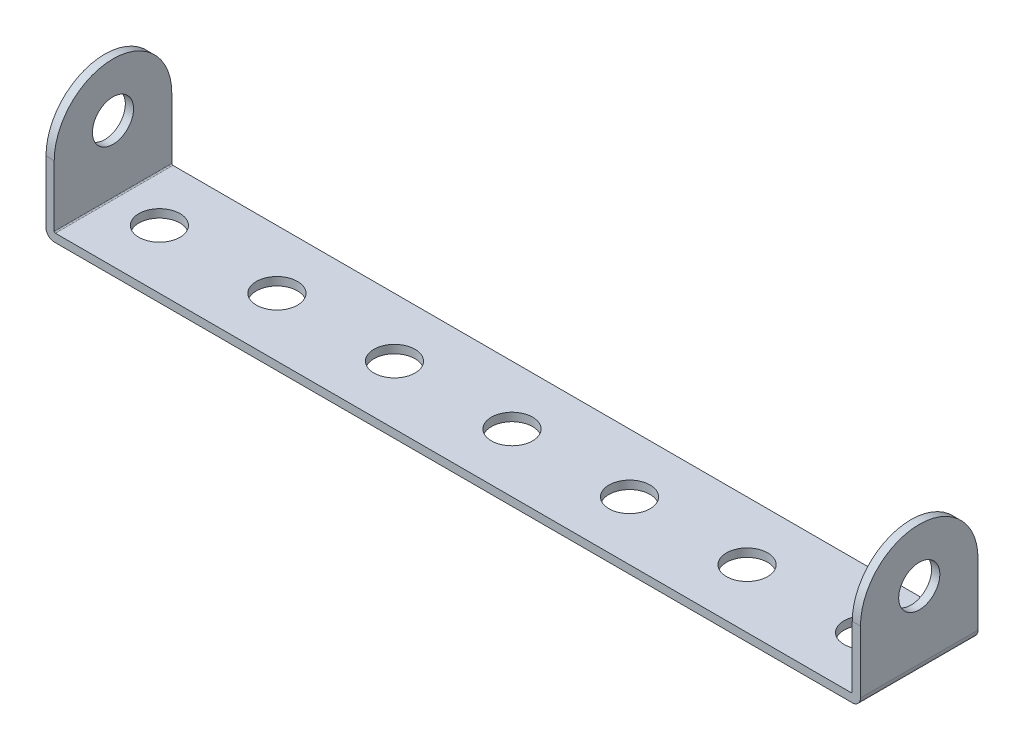
ISO-10303-21;
HEADER;
FILE_DESCRIPTION(('STEP AP214'),'2;1');
FILE_NAME('part.step','',(''),(''),'','','');
FILE_SCHEMA(('AUTOMOTIVE_DESIGN { 1 0 10303 214 1 1 1 1 }'));
ENDSEC;
DATA;
#1=APPLICATION_CONTEXT('core data for automotive mechanical design processes');
#2=APPLICATION_PROTOCOL_DEFINITION('international standard','automotive_design',2000,#1);
#3=PRODUCT_CONTEXT('',#1,'mechanical');
#4=PRODUCT('Part','Part','',(#3));
#5=PRODUCT_RELATED_PRODUCT_CATEGORY('part','',(#4));
#6=PRODUCT_DEFINITION_FORMATION('','',#4);
#7=PRODUCT_DEFINITION_CONTEXT('part definition',#1,'design');
#8=PRODUCT_DEFINITION('design','',#6,#7);
#9=PRODUCT_DEFINITION_SHAPE('','',#8);
#10=(LENGTH_UNIT() NAMED_UNIT(*) SI_UNIT(.MILLI.,.METRE.));
#11=(NAMED_UNIT(*) PLANE_ANGLE_UNIT() SI_UNIT($,.RADIAN.));
#12=(NAMED_UNIT(*) SI_UNIT($,.STERADIAN.) SOLID_ANGLE_UNIT());
#13=UNCERTAINTY_MEASURE_WITH_UNIT(LENGTH_MEASURE(1.E-05),#10,'distance_accuracy_value','');
#14=(GEOMETRIC_REPRESENTATION_CONTEXT(3) GLOBAL_UNCERTAINTY_ASSIGNED_CONTEXT((#13)) GLOBAL_UNIT_ASSIGNED_CONTEXT((#10,
#11,#12)) REPRESENTATION_CONTEXT('',''));
#15=CARTESIAN_POINT('',(0.,0.,0.));
#16=DIRECTION('',(0.,0.,1.));
#17=DIRECTION('',(1.,0.,0.));
#18=AXIS2_PLACEMENT_3D('',#15,#16,#17);
#19=CARTESIAN_POINT('',(69.4055,0.888999999999997,6.34999999999995));
#20=DIRECTION('',(0.,-1.,0.));
#21=DIRECTION('',(0.,0.,-1.));
#22=AXIS2_PLACEMENT_3D('',#19,#20,#21);
#23=CYLINDRICAL_SURFACE('',#22,2.2225);
#24=CARTESIAN_POINT('',(69.4055,0.,6.34999999999999));
#25=DIRECTION('',(0.,1.,0.));
#26=DIRECTION('',(1.,0.,0.));
#27=AXIS2_PLACEMENT_3D('',#24,#25,#26);
#28=CIRCLE('',#27,2.2225);
#29=CARTESIAN_POINT('',(71.628,0.,6.35));
#30=VERTEX_POINT('',#29);
#31=EDGE_CURVE('E231',#30,#30,#28,.T.);
#32=ORIENTED_EDGE('',*,*,#31,.F.);
#33=EDGE_LOOP('',(#32));
#34=FACE_BOUND('',#33,.T.);
#35=CARTESIAN_POINT('',(69.4055,0.888999999999997,6.34999999999995));
#36=DIRECTION('',(0.,-1.,0.));
#37=DIRECTION('',(0.,0.,-1.));
#38=AXIS2_PLACEMENT_3D('',#35,#36,#37);
#39=CIRCLE('',#38,2.2225);
#40=CARTESIAN_POINT('',(69.4055,0.888999999999997,4.12749999999995));
#41=VERTEX_POINT('',#40);
#42=EDGE_CURVE('E223',#41,#41,#39,.T.);
#43=ORIENTED_EDGE('',*,*,#42,.F.);
#44=EDGE_LOOP('',(#43));
#45=FACE_BOUND('',#44,.T.);
#46=ADVANCED_FACE('F16',(#34,#45),#23,.F.);
#47=CARTESIAN_POINT('',(5.90550000000001,0.888999999999994,6.34999999999998));
#48=DIRECTION('',(0.,-1.,0.));
#49=DIRECTION('',(0.,0.,-1.));
#50=AXIS2_PLACEMENT_3D('',#47,#48,#49);
#51=CYLINDRICAL_SURFACE('',#50,2.2225);
#52=CARTESIAN_POINT('',(5.90550000000001,0.,6.34999999999999));
#53=DIRECTION('',(0.,1.,0.));
#54=DIRECTION('',(1.,0.,0.));
#55=AXIS2_PLACEMENT_3D('',#52,#53,#54);
#56=CIRCLE('',#55,2.2225);
#57=CARTESIAN_POINT('',(8.12800000000001,0.,6.35));
#58=VERTEX_POINT('',#57);
#59=EDGE_CURVE('E397',#58,#58,#56,.T.);
#60=ORIENTED_EDGE('',*,*,#59,.F.);
#61=EDGE_LOOP('',(#60));
#62=FACE_BOUND('',#61,.T.);
#63=CARTESIAN_POINT('',(5.90550000000001,0.888999999999994,6.34999999999998));
#64=DIRECTION('',(0.,-1.,0.));
#65=DIRECTION('',(0.,0.,-1.));
#66=AXIS2_PLACEMENT_3D('',#63,#64,#65);
#67=CIRCLE('',#66,2.2225);
#68=CARTESIAN_POINT('',(5.90550000000001,0.888999999999994,4.12749999999998));
#69=VERTEX_POINT('',#68);
#70=EDGE_CURVE('E393',#69,#69,#67,.T.);
#71=ORIENTED_EDGE('',*,*,#70,.F.);
#72=EDGE_LOOP('',(#71));
#73=FACE_BOUND('',#72,.T.);
#74=ADVANCED_FACE('F319',(#62,#73),#51,.F.);
#75=CARTESIAN_POINT('',(31.3055,0.88899999999999,6.34999999999998));
#76=DIRECTION('',(0.,-1.,0.));
#77=DIRECTION('',(0.,0.,-1.));
#78=AXIS2_PLACEMENT_3D('',#75,#76,#77);
#79=CYLINDRICAL_SURFACE('',#78,2.2225);
#80=CARTESIAN_POINT('',(31.3055,0.,6.34999999999999));
#81=DIRECTION('',(0.,1.,0.));
#82=DIRECTION('',(1.,0.,0.));
#83=AXIS2_PLACEMENT_3D('',#80,#81,#82);
#84=CIRCLE('',#83,2.2225);
#85=CARTESIAN_POINT('',(33.528,0.,6.35));
#86=VERTEX_POINT('',#85);
#87=EDGE_CURVE('E389',#86,#86,#84,.T.);
#88=ORIENTED_EDGE('',*,*,#87,.F.);
#89=EDGE_LOOP('',(#88));
#90=FACE_BOUND('',#89,.T.);
#91=CARTESIAN_POINT('',(31.3055,0.88899999999999,6.34999999999998));
#92=DIRECTION('',(0.,-1.,0.));
#93=DIRECTION('',(0.,0.,-1.));
#94=AXIS2_PLACEMENT_3D('',#91,#92,#93);
#95=CIRCLE('',#94,2.2225);
#96=CARTESIAN_POINT('',(31.3055,0.88899999999999,4.12749999999998));
#97=VERTEX_POINT('',#96);
#98=EDGE_CURVE('E385',#97,#97,#95,.T.);
#99=ORIENTED_EDGE('',*,*,#98,.F.);
#100=EDGE_LOOP('',(#99));
#101=FACE_BOUND('',#100,.T.);
#102=ADVANCED_FACE('F325',(#90,#101),#79,.F.);
#103=CARTESIAN_POINT('',(44.0055,0.88899999999999,6.34999999999998));
#104=DIRECTION('',(0.,-1.,0.));
#105=DIRECTION('',(0.,0.,-1.));
#106=AXIS2_PLACEMENT_3D('',#103,#104,#105);
#107=CYLINDRICAL_SURFACE('',#106,2.2225);
#108=CARTESIAN_POINT('',(44.0055,0.,6.34999999999995));
#109=DIRECTION('',(0.,1.,0.));
#110=DIRECTION('',(1.,0.,0.));
#111=AXIS2_PLACEMENT_3D('',#108,#109,#110);
#112=CIRCLE('',#111,2.2225);
#113=CARTESIAN_POINT('',(46.228,0.,6.34999999999995));
#114=VERTEX_POINT('',#113);
#115=EDGE_CURVE('E381',#114,#114,#112,.T.);
#116=ORIENTED_EDGE('',*,*,#115,.F.);
#117=EDGE_LOOP('',(#116));
#118=FACE_BOUND('',#117,.T.);
#119=CARTESIAN_POINT('',(44.0055,0.88899999999999,6.34999999999998));
#120=DIRECTION('',(0.,-1.,0.));
#121=DIRECTION('',(0.,0.,-1.));
#122=AXIS2_PLACEMENT_3D('',#119,#120,#121);
#123=CIRCLE('',#122,2.2225);
#124=CARTESIAN_POINT('',(44.0055,0.88899999999999,4.12749999999998));
#125=VERTEX_POINT('',#124);
#126=EDGE_CURVE('E377',#125,#125,#123,.T.);
#127=ORIENTED_EDGE('',*,*,#126,.F.);
#128=EDGE_LOOP('',(#127));
#129=FACE_BOUND('',#128,.T.);
#130=ADVANCED_FACE('F335',(#118,#129),#107,.F.);
#131=CARTESIAN_POINT('',(18.6054999999999,0.888999999999997,6.34999999999998));
#132=DIRECTION('',(0.,-1.,0.));
#133=DIRECTION('',(0.,0.,-1.));
#134=AXIS2_PLACEMENT_3D('',#131,#132,#133);
#135=CYLINDRICAL_SURFACE('',#134,2.2225);
#136=CARTESIAN_POINT('',(18.6054999999999,0.,6.34999999999999));
#137=DIRECTION('',(0.,1.,0.));
#138=DIRECTION('',(1.,0.,0.));
#139=AXIS2_PLACEMENT_3D('',#136,#137,#138);
#140=CIRCLE('',#139,2.2225);
#141=CARTESIAN_POINT('',(20.8279999999999,0.,6.35));
#142=VERTEX_POINT('',#141);
#143=EDGE_CURVE('E373',#142,#142,#140,.T.);
#144=ORIENTED_EDGE('',*,*,#143,.F.);
#145=EDGE_LOOP('',(#144));
#146=FACE_BOUND('',#145,.T.);
#147=CARTESIAN_POINT('',(18.6054999999999,0.888999999999997,6.34999999999998));
#148=DIRECTION('',(0.,-1.,0.));
#149=DIRECTION('',(0.,0.,-1.));
#150=AXIS2_PLACEMENT_3D('',#147,#148,#149);
#151=CIRCLE('',#150,2.2225);
#152=CARTESIAN_POINT('',(18.6054999999999,0.888999999999997,4.12749999999998));
#153=VERTEX_POINT('',#152);
#154=EDGE_CURVE('E364',#153,#153,#151,.T.);
#155=ORIENTED_EDGE('',*,*,#154,.F.);
#156=EDGE_LOOP('',(#155));
#157=FACE_BOUND('',#156,.T.);
#158=ADVANCED_FACE('F339',(#146,#157),#135,.F.);
#159=CARTESIAN_POINT('',(56.7055,0.888999999999994,6.34999999999998));
#160=DIRECTION('',(0.,-1.,0.));
#161=DIRECTION('',(0.,0.,-1.));
#162=AXIS2_PLACEMENT_3D('',#159,#160,#161);
#163=CYLINDRICAL_SURFACE('',#162,2.2225);
#164=CARTESIAN_POINT('',(56.7055,0.,6.34999999999999));
#165=DIRECTION('',(0.,1.,0.));
#166=DIRECTION('',(1.,0.,0.));
#167=AXIS2_PLACEMENT_3D('',#164,#165,#166);
#168=CIRCLE('',#167,2.2225);
#169=CARTESIAN_POINT('',(58.928,0.,6.35));
#170=VERTEX_POINT('',#169);
#171=EDGE_CURVE('E368',#170,#170,#168,.T.);
#172=ORIENTED_EDGE('',*,*,#171,.F.);
#173=EDGE_LOOP('',(#172));
#174=FACE_BOUND('',#173,.T.);
#175=CARTESIAN_POINT('',(56.7055,0.888999999999994,6.34999999999998));
#176=DIRECTION('',(0.,-1.,0.));
#177=DIRECTION('',(0.,0.,-1.));
#178=AXIS2_PLACEMENT_3D('',#175,#176,#177);
#179=CIRCLE('',#178,2.2225);
#180=CARTESIAN_POINT('',(56.7055,0.888999999999994,4.12749999999998));
#181=VERTEX_POINT('',#180);
#182=EDGE_CURVE('E359',#181,#181,#179,.T.);
#183=ORIENTED_EDGE('',*,*,#182,.F.);
#184=EDGE_LOOP('',(#183));
#185=FACE_BOUND('',#184,.T.);
#186=ADVANCED_FACE('F341',(#174,#185),#163,.F.);
#187=CARTESIAN_POINT('',(82.1055,0.888999999999997,6.34999999999997));
#188=DIRECTION('',(0.,-1.,0.));
#189=DIRECTION('',(0.,0.,-1.));
#190=AXIS2_PLACEMENT_3D('',#187,#188,#189);
#191=CYLINDRICAL_SURFACE('',#190,2.2225);
#192=CARTESIAN_POINT('',(82.1055,0.,6.35000000000001));
#193=DIRECTION('',(0.,1.,0.));
#194=DIRECTION('',(1.,0.,0.));
#195=AXIS2_PLACEMENT_3D('',#192,#193,#194);
#196=CIRCLE('',#195,2.2225);
#197=CARTESIAN_POINT('',(84.3280000000001,0.,6.35000000000001));
#198=VERTEX_POINT('',#197);
#199=EDGE_CURVE('E211',#198,#198,#196,.T.);
#200=ORIENTED_EDGE('',*,*,#199,.F.);
#201=EDGE_LOOP('',(#200));
#202=FACE_BOUND('',#201,.T.);
#203=CARTESIAN_POINT('',(82.1055,0.888999999999997,6.34999999999997));
#204=DIRECTION('',(0.,-1.,0.));
#205=DIRECTION('',(0.,0.,-1.));
#206=AXIS2_PLACEMENT_3D('',#203,#204,#205);
#207=CIRCLE('',#206,2.2225);
#208=CARTESIAN_POINT('',(82.1055,0.888999999999997,4.12749999999997));
#209=VERTEX_POINT('',#208);
#210=EDGE_CURVE('E191',#209,#209,#207,.T.);
#211=ORIENTED_EDGE('',*,*,#210,.F.);
#212=EDGE_LOOP('',(#211));
#213=FACE_BOUND('',#212,.T.);
#214=ADVANCED_FACE('F315',(#202,#213),#191,.F.);
#215=CARTESIAN_POINT('',(88.011,7.61999999999998,6.34999999999997));
#216=DIRECTION('',(-1.,0.,0.));
#217=DIRECTION('',(0.,0.,1.));
#218=AXIS2_PLACEMENT_3D('',#215,#216,#217);
#219=CYLINDRICAL_SURFACE('',#218,6.35);
#220=CARTESIAN_POINT('',(0.889000000000029,7.62000000000004,6.34999999999994));
#221=DIRECTION('',(1.,0.,0.));
#222=DIRECTION('',(0.,1.,0.));
#223=AXIS2_PLACEMENT_3D('',#220,#221,#222);
#224=CIRCLE('',#223,6.35);
#225=CARTESIAN_POINT('',(0.889000000000029,7.61999999999996,0.));
#226=VERTEX_POINT('',#225);
#227=CARTESIAN_POINT('',(0.889000000000029,7.61999999999998,12.7));
#228=VERTEX_POINT('',#227);
#229=EDGE_CURVE('E173',#226,#228,#224,.T.);
#230=ORIENTED_EDGE('',*,*,#229,.F.);
#231=DIRECTION('',(1.,0.,0.));
#232=VECTOR('',#231,1.);
#233=CARTESIAN_POINT('',(88.011,7.61999999999996,0.));
#234=LINE('',#233,#232);
#235=CARTESIAN_POINT('',(0.,7.61999999999996,0.));
#236=VERTEX_POINT('',#235);
#237=EDGE_CURVE('E36',#236,#226,#234,.T.);
#238=ORIENTED_EDGE('',*,*,#237,.F.);
#239=CARTESIAN_POINT('',(0.,7.62000000000004,6.34999999999994));
#240=DIRECTION('',(-1.,0.,0.));
#241=DIRECTION('',(0.,0.,1.));
#242=AXIS2_PLACEMENT_3D('',#239,#240,#241);
#243=CIRCLE('',#242,6.35);
#244=CARTESIAN_POINT('',(0.,7.61999999999998,12.7));
#245=VERTEX_POINT('',#244);
#246=EDGE_CURVE('E129',#245,#236,#243,.T.);
#247=ORIENTED_EDGE('',*,*,#246,.F.);
#248=DIRECTION('',(1.,0.,0.));
#249=VECTOR('',#248,1.);
#250=CARTESIAN_POINT('',(88.011,7.61999999999996,12.7));
#251=LINE('',#250,#249);
#252=EDGE_CURVE('E11',#245,#228,#251,.T.);
#253=ORIENTED_EDGE('',*,*,#252,.T.);
#254=EDGE_LOOP('',(#230,#238,#247,#253));
#255=FACE_BOUND('',#254,.T.);
#256=ADVANCED_FACE('F279',(#255),#219,.T.);
#257=CARTESIAN_POINT('',(88.011,7.61999999999998,6.34999999999997));
#258=DIRECTION('',(-1.,0.,0.));
#259=DIRECTION('',(0.,0.,1.));
#260=AXIS2_PLACEMENT_3D('',#257,#258,#259);
#261=CYLINDRICAL_SURFACE('',#260,6.35);
#262=CARTESIAN_POINT('',(87.122,7.61999999999998,6.34999999999997));
#263=DIRECTION('',(-1.,0.,0.));
#264=DIRECTION('',(0.,0.,1.));
#265=AXIS2_PLACEMENT_3D('',#262,#263,#264);
#266=CIRCLE('',#265,6.35);
#267=CARTESIAN_POINT('',(87.122,7.61999999999996,12.7));
#268=VERTEX_POINT('',#267);
#269=CARTESIAN_POINT('',(87.122,7.61999999999996,0.));
#270=VERTEX_POINT('',#269);
#271=EDGE_CURVE('E141',#268,#270,#266,.T.);
#272=ORIENTED_EDGE('',*,*,#271,.F.);
#273=DIRECTION('',(1.,0.,0.));
#274=VECTOR('',#273,1.);
#275=CARTESIAN_POINT('',(88.011,7.61999999999996,12.7));
#276=LINE('',#275,#274);
#277=CARTESIAN_POINT('',(88.011,7.61999999999996,12.7));
#278=VERTEX_POINT('',#277);
#279=EDGE_CURVE('E27',#268,#278,#276,.T.);
#280=ORIENTED_EDGE('',*,*,#279,.T.);
#281=CARTESIAN_POINT('',(88.011,7.61999999999998,6.34999999999997));
#282=DIRECTION('',(1.,0.,0.));
#283=DIRECTION('',(0.,1.,0.));
#284=AXIS2_PLACEMENT_3D('',#281,#282,#283);
#285=CIRCLE('',#284,6.35);
#286=CARTESIAN_POINT('',(88.011,7.61999999999996,0.));
#287=VERTEX_POINT('',#286);
#288=EDGE_CURVE('E151',#287,#278,#285,.T.);
#289=ORIENTED_EDGE('',*,*,#288,.F.);
#290=DIRECTION('',(1.,0.,0.));
#291=VECTOR('',#290,1.);
#292=CARTESIAN_POINT('',(88.011,7.61999999999996,0.));
#293=LINE('',#292,#291);
#294=EDGE_CURVE('E156',#270,#287,#293,.T.);
#295=ORIENTED_EDGE('',*,*,#294,.F.);
#296=EDGE_LOOP('',(#272,#280,#289,#295));
#297=FACE_BOUND('',#296,.T.);
#298=ADVANCED_FACE('F304',(#297),#261,.T.);
#299=CARTESIAN_POINT('',(88.011,8.19149999999996,6.35000000000001));
#300=DIRECTION('',(-1.,0.,0.));
#301=DIRECTION('',(0.,0.,1.));
#302=AXIS2_PLACEMENT_3D('',#299,#300,#301);
#303=CYLINDRICAL_SURFACE('',#302,2.2225);
#304=CARTESIAN_POINT('',(88.011,8.19149999999996,6.35000000000001));
#305=DIRECTION('',(-1.,0.,0.));
#306=DIRECTION('',(0.,0.,1.));
#307=AXIS2_PLACEMENT_3D('',#304,#305,#306);
#308=CIRCLE('',#307,2.2225);
#309=CARTESIAN_POINT('',(88.011,8.19149999999996,8.57250000000001));
#310=VERTEX_POINT('',#309);
#311=EDGE_CURVE('E154',#310,#310,#308,.T.);
#312=ORIENTED_EDGE('',*,*,#311,.F.);
#313=EDGE_LOOP('',(#312));
#314=FACE_BOUND('',#313,.T.);
#315=CARTESIAN_POINT('',(87.122,8.19149999999996,6.35000000000001));
#316=DIRECTION('',(1.,0.,0.));
#317=DIRECTION('',(0.,0.,1.));
#318=AXIS2_PLACEMENT_3D('',#315,#316,#317);
#319=CIRCLE('',#318,2.2225);
#320=CARTESIAN_POINT('',(87.122,8.19149999999996,8.57250000000001));
#321=VERTEX_POINT('',#320);
#322=EDGE_CURVE('E164',#321,#321,#319,.T.);
#323=ORIENTED_EDGE('',*,*,#322,.F.);
#324=EDGE_LOOP('',(#323));
#325=FACE_BOUND('',#324,.T.);
#326=ADVANCED_FACE('F306',(#314,#325),#303,.F.);
#327=CARTESIAN_POINT('',(88.011,8.19149999999996,6.35000000000001));
#328=DIRECTION('',(-1.,0.,0.));
#329=DIRECTION('',(0.,0.,1.));
#330=AXIS2_PLACEMENT_3D('',#327,#328,#329);
#331=CYLINDRICAL_SURFACE('',#330,2.2225);
#332=CARTESIAN_POINT('',(0.889000000000029,8.19150000000004,6.34999999999997));
#333=DIRECTION('',(-1.,0.,0.));
#334=DIRECTION('',(0.,1.,0.));
#335=AXIS2_PLACEMENT_3D('',#332,#333,#334);
#336=CIRCLE('',#335,2.2225);
#337=CARTESIAN_POINT('',(0.889000000000028,10.414,6.34999999999997));
#338=VERTEX_POINT('',#337);
#339=EDGE_CURVE('E150',#338,#338,#336,.T.);
#340=ORIENTED_EDGE('',*,*,#339,.F.);
#341=EDGE_LOOP('',(#340));
#342=FACE_BOUND('',#341,.T.);
#343=CARTESIAN_POINT('',(0.,8.19150000000004,6.34999999999997));
#344=DIRECTION('',(1.,0.,0.));
#345=DIRECTION('',(0.,1.,0.));
#346=AXIS2_PLACEMENT_3D('',#343,#344,#345);
#347=CIRCLE('',#346,2.2225);
#348=CARTESIAN_POINT('',(0.,10.414,6.34999999999997));
#349=VERTEX_POINT('',#348);
#350=EDGE_CURVE('E159',#349,#349,#347,.T.);
#351=ORIENTED_EDGE('',*,*,#350,.F.);
#352=EDGE_LOOP('',(#351));
#353=FACE_BOUND('',#352,.T.);
#354=ADVANCED_FACE('F312',(#342,#353),#331,.F.);
#355=CARTESIAN_POINT('',(44.0054999999999,2.14211144567669,12.7));
#356=DIRECTION('',(0.,0.,1.));
#357=DIRECTION('',(1.,0.,0.));
#358=AXIS2_PLACEMENT_3D('',#355,#356,#357);
#359=PLANE('',#358);
#360=ORIENTED_EDGE('',*,*,#279,.F.);
#361=DIRECTION('',(0.,1.,0.));
#362=VECTOR('',#361,1.);
#363=CARTESIAN_POINT('',(87.122,13.97,12.7));
#364=LINE('',#363,#362);
#365=CARTESIAN_POINT('',(87.122,1.01599999999999,12.7));
#366=VERTEX_POINT('',#365);
#367=EDGE_CURVE('E168',#366,#268,#364,.T.);
#368=ORIENTED_EDGE('',*,*,#367,.F.);
#369=CARTESIAN_POINT('',(86.9949999999999,1.01600000000004,12.7));
#370=DIRECTION('',(0.,0.,1.));
#371=DIRECTION('',(1.,0.,0.));
#372=AXIS2_PLACEMENT_3D('',#369,#370,#371);
#373=CIRCLE('',#372,0.127);
#374=CARTESIAN_POINT('',(86.995,0.888999999999997,12.7));
#375=VERTEX_POINT('',#374);
#376=EDGE_CURVE('E181',#375,#366,#373,.T.);
#377=ORIENTED_EDGE('',*,*,#376,.F.);
#378=DIRECTION('',(1.,0.,0.));
#379=VECTOR('',#378,1.);
#380=CARTESIAN_POINT('',(86.995,0.888999999999997,12.7));
#381=LINE('',#380,#379);
#382=CARTESIAN_POINT('',(1.01599999999991,0.888999999999942,12.7));
#383=VERTEX_POINT('',#382);
#384=EDGE_CURVE('E187',#383,#375,#381,.T.);
#385=ORIENTED_EDGE('',*,*,#384,.F.);
#386=CARTESIAN_POINT('',(1.01599999999991,1.01599999999999,12.7));
#387=DIRECTION('',(0.,0.,1.));
#388=DIRECTION('',(1.,0.,0.));
#389=AXIS2_PLACEMENT_3D('',#386,#387,#388);
#390=CIRCLE('',#389,0.127);
#391=CARTESIAN_POINT('',(0.888999999999918,1.01599999999999,12.7));
#392=VERTEX_POINT('',#391);
#393=EDGE_CURVE('E193',#392,#383,#390,.T.);
#394=ORIENTED_EDGE('',*,*,#393,.F.);
#395=DIRECTION('',(0.,-1.,0.));
#396=VECTOR('',#395,1.);
#397=CARTESIAN_POINT('',(0.888999999999918,1.01599999999999,12.7));
#398=LINE('',#397,#396);
#399=EDGE_CURVE('E199',#228,#392,#398,.T.);
#400=ORIENTED_EDGE('',*,*,#399,.F.);
#401=ORIENTED_EDGE('',*,*,#252,.F.);
#402=DIRECTION('',(0.,1.,0.));
#403=VECTOR('',#402,1.);
#404=CARTESIAN_POINT('',(0.,13.97,12.7));
#405=LINE('',#404,#403);
#406=CARTESIAN_POINT('',(0.,0.888999999999942,12.7));
#407=VERTEX_POINT('',#406);
#408=EDGE_CURVE('E120',#407,#245,#405,.T.);
#409=ORIENTED_EDGE('',*,*,#408,.F.);
#410=CARTESIAN_POINT('',(0.889000000000029,0.889000000000053,12.7));
#411=DIRECTION('',(0.,0.,-1.));
#412=DIRECTION('',(0.,-1.,0.));
#413=AXIS2_PLACEMENT_3D('',#410,#411,#412);
#414=CIRCLE('',#413,0.889);
#415=CARTESIAN_POINT('',(0.889000000000029,0.,12.7));
#416=VERTEX_POINT('',#415);
#417=EDGE_CURVE('E115',#416,#407,#414,.T.);
#418=ORIENTED_EDGE('',*,*,#417,.F.);
#419=DIRECTION('',(-1.,0.,0.));
#420=VECTOR('',#419,1.);
#421=CARTESIAN_POINT('',(0.889000000000029,0.,12.7));
#422=LINE('',#421,#420);
#423=CARTESIAN_POINT('',(87.122,0.,12.7));
#424=VERTEX_POINT('',#423);
#425=EDGE_CURVE('E208',#424,#416,#422,.T.);
#426=ORIENTED_EDGE('',*,*,#425,.F.);
#427=CARTESIAN_POINT('',(87.122,0.889000000000001,12.7));
#428=DIRECTION('',(0.,0.,-1.));
#429=DIRECTION('',(0.,-1.,0.));
#430=AXIS2_PLACEMENT_3D('',#427,#428,#429);
#431=CIRCLE('',#430,0.889000000000006);
#432=CARTESIAN_POINT('',(88.011,0.888999999999997,12.7));
#433=VERTEX_POINT('',#432);
#434=EDGE_CURVE('E169',#433,#424,#431,.T.);
#435=ORIENTED_EDGE('',*,*,#434,.F.);
#436=DIRECTION('',(0.,-1.,0.));
#437=VECTOR('',#436,1.);
#438=CARTESIAN_POINT('',(88.011,0.888999999999997,12.7));
#439=LINE('',#438,#437);
#440=EDGE_CURVE('E155',#278,#433,#439,.T.);
#441=ORIENTED_EDGE('',*,*,#440,.F.);
#442=EDGE_LOOP('',(#360,#368,#377,#385,#394,#400,#401,#409,#418,#426,#435,#441));
#443=FACE_BOUND('',#442,.T.);
#444=ADVANCED_FACE('F275',(#443),#359,.T.);
#445=CARTESIAN_POINT('',(0.889000000000029,13.97,0.));
#446=DIRECTION('',(1.,0.,0.));
#447=DIRECTION('',(0.,1.,0.));
#448=AXIS2_PLACEMENT_3D('',#445,#446,#447);
#449=PLANE('',#448);
#450=ORIENTED_EDGE('',*,*,#339,.T.);
#451=EDGE_LOOP('',(#450));
#452=FACE_BOUND('',#451,.T.);
#453=ORIENTED_EDGE('',*,*,#229,.T.);
#454=ORIENTED_EDGE('',*,*,#399,.T.);
#455=DIRECTION('',(0.,0.,1.));
#456=VECTOR('',#455,1.);
#457=CARTESIAN_POINT('',(0.889000000000029,1.01600000000005,0.));
#458=LINE('',#457,#456);
#459=CARTESIAN_POINT('',(0.889000000000029,1.01600000000005,0.));
#460=VERTEX_POINT('',#459);
#461=EDGE_CURVE('E219',#460,#392,#458,.T.);
#462=ORIENTED_EDGE('',*,*,#461,.F.);
#463=DIRECTION('',(0.,1.,0.));
#464=VECTOR('',#463,1.);
#465=CARTESIAN_POINT('',(0.889000000000029,1.01600000000005,0.));
#466=LINE('',#465,#464);
#467=EDGE_CURVE('E163',#460,#226,#466,.T.);
#468=ORIENTED_EDGE('',*,*,#467,.T.);
#469=EDGE_LOOP('',(#453,#454,#462,#468));
#470=FACE_BOUND('',#469,.T.);
#471=ADVANCED_FACE('F290',(#452,#470),#449,.T.);
#472=CARTESIAN_POINT('',(88.011,13.97,0.));
#473=DIRECTION('',(1.,0.,0.));
#474=DIRECTION('',(0.,0.,-1.));
#475=AXIS2_PLACEMENT_3D('',#472,#473,#474);
#476=PLANE('',#475);
#477=ORIENTED_EDGE('',*,*,#311,.T.);
#478=EDGE_LOOP('',(#477));
#479=FACE_BOUND('',#478,.T.);
#480=ORIENTED_EDGE('',*,*,#288,.T.);
#481=ORIENTED_EDGE('',*,*,#440,.T.);
#482=DIRECTION('',(0.,0.,1.));
#483=VECTOR('',#482,1.);
#484=CARTESIAN_POINT('',(88.011,0.888999999999973,0.));
#485=LINE('',#484,#483);
#486=CARTESIAN_POINT('',(88.011,0.888999999999973,0.));
#487=VERTEX_POINT('',#486);
#488=EDGE_CURVE('E227',#487,#433,#485,.T.);
#489=ORIENTED_EDGE('',*,*,#488,.F.);
#490=DIRECTION('',(0.,1.,0.));
#491=VECTOR('',#490,1.);
#492=CARTESIAN_POINT('',(88.011,0.888999999999973,0.));
#493=LINE('',#492,#491);
#494=EDGE_CURVE('E197',#487,#287,#493,.T.);
#495=ORIENTED_EDGE('',*,*,#494,.T.);
#496=EDGE_LOOP('',(#480,#481,#489,#495));
#497=FACE_BOUND('',#496,.T.);
#498=ADVANCED_FACE('F271',(#479,#497),#476,.T.);
#499=CARTESIAN_POINT('',(1.01600000000002,1.01599999999999,0.));
#500=DIRECTION('',(0.,0.,1.));
#501=DIRECTION('',(1.,0.,0.));
#502=AXIS2_PLACEMENT_3D('',#499,#500,#501);
#503=CYLINDRICAL_SURFACE('',#502,0.127);
#504=ORIENTED_EDGE('',*,*,#393,.T.);
#505=DIRECTION('',(0.,0.,1.));
#506=VECTOR('',#505,1.);
#507=CARTESIAN_POINT('',(1.01600000000002,0.888999999999973,0.));
#508=LINE('',#507,#506);
#509=CARTESIAN_POINT('',(1.01600000000002,0.888999999999973,0.));
#510=VERTEX_POINT('',#509);
#511=EDGE_CURVE('E185',#510,#383,#508,.T.);
#512=ORIENTED_EDGE('',*,*,#511,.F.);
#513=CARTESIAN_POINT('',(1.01600000000002,1.01599999999999,0.));
#514=DIRECTION('',(0.,0.,-1.));
#515=DIRECTION('',(0.,-1.,0.));
#516=AXIS2_PLACEMENT_3D('',#513,#514,#515);
#517=CIRCLE('',#516,0.127);
#518=EDGE_CURVE('E198',#510,#460,#517,.T.);
#519=ORIENTED_EDGE('',*,*,#518,.T.);
#520=ORIENTED_EDGE('',*,*,#461,.T.);
#521=EDGE_LOOP('',(#504,#512,#519,#520));
#522=FACE_BOUND('',#521,.T.);
#523=ADVANCED_FACE('F294',(#522),#503,.F.);
#524=CARTESIAN_POINT('',(1.01600000000002,0.888999999999973,0.));
#525=DIRECTION('',(0.,1.,0.));
#526=DIRECTION('',(-1.,0.,0.));
#527=AXIS2_PLACEMENT_3D('',#524,#525,#526);
#528=PLANE('',#527);
#529=ORIENTED_EDGE('',*,*,#42,.T.);
#530=EDGE_LOOP('',(#529));
#531=FACE_BOUND('',#530,.T.);
#532=ORIENTED_EDGE('',*,*,#70,.T.);
#533=EDGE_LOOP('',(#532));
#534=FACE_BOUND('',#533,.T.);
#535=ORIENTED_EDGE('',*,*,#98,.T.);
#536=EDGE_LOOP('',(#535));
#537=FACE_BOUND('',#536,.T.);
#538=ORIENTED_EDGE('',*,*,#126,.T.);
#539=EDGE_LOOP('',(#538));
#540=FACE_BOUND('',#539,.T.);
#541=ORIENTED_EDGE('',*,*,#154,.T.);
#542=EDGE_LOOP('',(#541));
#543=FACE_BOUND('',#542,.T.);
#544=ORIENTED_EDGE('',*,*,#182,.T.);
#545=EDGE_LOOP('',(#544));
#546=FACE_BOUND('',#545,.T.);
#547=ORIENTED_EDGE('',*,*,#210,.T.);
#548=EDGE_LOOP('',(#547));
#549=FACE_BOUND('',#548,.T.);
#550=ORIENTED_EDGE('',*,*,#384,.T.);
#551=DIRECTION('',(0.,0.,1.));
#552=VECTOR('',#551,1.);
#553=CARTESIAN_POINT('',(86.995,0.888999999999973,0.));
#554=LINE('',#553,#552);
#555=CARTESIAN_POINT('',(86.995,0.888999999999973,0.));
#556=VERTEX_POINT('',#555);
#557=EDGE_CURVE('E145',#556,#375,#554,.T.);
#558=ORIENTED_EDGE('',*,*,#557,.F.);
#559=DIRECTION('',(-1.,0.,0.));
#560=VECTOR('',#559,1.);
#561=CARTESIAN_POINT('',(86.995,0.888999999999973,0.));
#562=LINE('',#561,#560);
#563=EDGE_CURVE('E192',#556,#510,#562,.T.);
#564=ORIENTED_EDGE('',*,*,#563,.T.);
#565=ORIENTED_EDGE('',*,*,#511,.T.);
#566=EDGE_LOOP('',(#550,#558,#564,#565));
#567=FACE_BOUND('',#566,.T.);
#568=ADVANCED_FACE('F296',(#531,#534,#537,#540,#543,#546,#549,#567),#528,.T.);
#569=CARTESIAN_POINT('',(86.9949999999999,1.01600000000002,0.));
#570=DIRECTION('',(0.,0.,1.));
#571=DIRECTION('',(1.,0.,0.));
#572=AXIS2_PLACEMENT_3D('',#569,#570,#571);
#573=CYLINDRICAL_SURFACE('',#572,0.127);
#574=ORIENTED_EDGE('',*,*,#376,.T.);
#575=DIRECTION('',(0.,0.,1.));
#576=VECTOR('',#575,1.);
#577=CARTESIAN_POINT('',(87.122,1.016,0.));
#578=LINE('',#577,#576);
#579=CARTESIAN_POINT('',(87.122,1.016,0.));
#580=VERTEX_POINT('',#579);
#581=EDGE_CURVE('E180',#580,#366,#578,.T.);
#582=ORIENTED_EDGE('',*,*,#581,.F.);
#583=CARTESIAN_POINT('',(86.9949999999999,1.01600000000002,0.));
#584=DIRECTION('',(0.,0.,-1.));
#585=DIRECTION('',(0.,-1.,0.));
#586=AXIS2_PLACEMENT_3D('',#583,#584,#585);
#587=CIRCLE('',#586,0.127);
#588=EDGE_CURVE('E186',#580,#556,#587,.T.);
#589=ORIENTED_EDGE('',*,*,#588,.T.);
#590=ORIENTED_EDGE('',*,*,#557,.T.);
#591=EDGE_LOOP('',(#574,#582,#589,#590));
#592=FACE_BOUND('',#591,.T.);
#593=ADVANCED_FACE('F299',(#592),#573,.F.);
#594=CARTESIAN_POINT('',(87.122,1.016,0.));
#595=DIRECTION('',(-1.,0.,0.));
#596=DIRECTION('',(0.,-1.,0.));
#597=AXIS2_PLACEMENT_3D('',#594,#595,#596);
#598=PLANE('',#597);
#599=ORIENTED_EDGE('',*,*,#271,.T.);
#600=DIRECTION('',(0.,-1.,0.));
#601=VECTOR('',#600,1.);
#602=CARTESIAN_POINT('',(87.122,13.97,0.));
#603=LINE('',#602,#601);
#604=EDGE_CURVE('E146',#270,#580,#603,.T.);
#605=ORIENTED_EDGE('',*,*,#604,.T.);
#606=ORIENTED_EDGE('',*,*,#581,.T.);
#607=ORIENTED_EDGE('',*,*,#367,.T.);
#608=EDGE_LOOP('',(#599,#605,#606,#607));
#609=FACE_BOUND('',#608,.T.);
#610=ORIENTED_EDGE('',*,*,#322,.T.);
#611=EDGE_LOOP('',(#610));
#612=FACE_BOUND('',#611,.T.);
#613=ADVANCED_FACE('F301',(#609,#612),#598,.T.);
#614=CARTESIAN_POINT('',(87.122,0.889000000000001,0.));
#615=DIRECTION('',(0.,0.,1.));
#616=DIRECTION('',(1.,0.,0.));
#617=AXIS2_PLACEMENT_3D('',#614,#615,#616);
#618=CYLINDRICAL_SURFACE('',#617,0.889000000000006);
#619=ORIENTED_EDGE('',*,*,#434,.T.);
#620=DIRECTION('',(0.,0.,1.));
#621=VECTOR('',#620,1.);
#622=CARTESIAN_POINT('',(87.122,0.,0.));
#623=LINE('',#622,#621);
#624=CARTESIAN_POINT('',(87.122,0.,0.));
#625=VERTEX_POINT('',#624);
#626=EDGE_CURVE('E207',#625,#424,#623,.T.);
#627=ORIENTED_EDGE('',*,*,#626,.F.);
#628=CARTESIAN_POINT('',(87.122,0.889000000000001,0.));
#629=DIRECTION('',(0.,0.,1.));
#630=DIRECTION('',(1.,0.,0.));
#631=AXIS2_PLACEMENT_3D('',#628,#629,#630);
#632=CIRCLE('',#631,0.889000000000006);
#633=EDGE_CURVE('E215',#625,#487,#632,.T.);
#634=ORIENTED_EDGE('',*,*,#633,.T.);
#635=ORIENTED_EDGE('',*,*,#488,.T.);
#636=EDGE_LOOP('',(#619,#627,#634,#635));
#637=FACE_BOUND('',#636,.T.);
#638=ADVANCED_FACE('F266',(#637),#618,.T.);
#639=CARTESIAN_POINT('',(87.122,0.,0.));
#640=DIRECTION('',(0.,-1.,0.));
#641=DIRECTION('',(1.,0.,0.));
#642=AXIS2_PLACEMENT_3D('',#639,#640,#641);
#643=PLANE('',#642);
#644=ORIENTED_EDGE('',*,*,#31,.T.);
#645=EDGE_LOOP('',(#644));
#646=FACE_BOUND('',#645,.T.);
#647=ORIENTED_EDGE('',*,*,#59,.T.);
#648=EDGE_LOOP('',(#647));
#649=FACE_BOUND('',#648,.T.);
#650=ORIENTED_EDGE('',*,*,#87,.T.);
#651=EDGE_LOOP('',(#650));
#652=FACE_BOUND('',#651,.T.);
#653=ORIENTED_EDGE('',*,*,#115,.T.);
#654=EDGE_LOOP('',(#653));
#655=FACE_BOUND('',#654,.T.);
#656=ORIENTED_EDGE('',*,*,#143,.T.);
#657=EDGE_LOOP('',(#656));
#658=FACE_BOUND('',#657,.T.);
#659=ORIENTED_EDGE('',*,*,#171,.T.);
#660=EDGE_LOOP('',(#659));
#661=FACE_BOUND('',#660,.T.);
#662=ORIENTED_EDGE('',*,*,#199,.T.);
#663=EDGE_LOOP('',(#662));
#664=FACE_BOUND('',#663,.T.);
#665=ORIENTED_EDGE('',*,*,#425,.T.);
#666=DIRECTION('',(0.,0.,1.));
#667=VECTOR('',#666,1.);
#668=CARTESIAN_POINT('',(0.889000000000029,0.,0.));
#669=LINE('',#668,#667);
#670=CARTESIAN_POINT('',(0.889000000000029,0.,0.));
#671=VERTEX_POINT('',#670);
#672=EDGE_CURVE('E105',#671,#416,#669,.T.);
#673=ORIENTED_EDGE('',*,*,#672,.F.);
#674=DIRECTION('',(1.,0.,0.));
#675=VECTOR('',#674,1.);
#676=CARTESIAN_POINT('',(0.889000000000029,0.,0.));
#677=LINE('',#676,#675);
#678=EDGE_CURVE('E124',#671,#625,#677,.T.);
#679=ORIENTED_EDGE('',*,*,#678,.T.);
#680=ORIENTED_EDGE('',*,*,#626,.T.);
#681=EDGE_LOOP('',(#665,#673,#679,#680));
#682=FACE_BOUND('',#681,.T.);
#683=ADVANCED_FACE('F264',(#646,#649,#652,#655,#658,#661,#664,#682),#643,.T.);
#684=CARTESIAN_POINT('',(0.889000000000029,0.889000000000022,0.));
#685=DIRECTION('',(0.,0.,1.));
#686=DIRECTION('',(1.,0.,0.));
#687=AXIS2_PLACEMENT_3D('',#684,#685,#686);
#688=CYLINDRICAL_SURFACE('',#687,0.889);
#689=ORIENTED_EDGE('',*,*,#417,.T.);
#690=DIRECTION('',(0.,0.,1.));
#691=VECTOR('',#690,1.);
#692=CARTESIAN_POINT('',(0.,0.888999999999973,0.));
#693=LINE('',#692,#691);
#694=CARTESIAN_POINT('',(0.,0.888999999999973,0.));
#695=VERTEX_POINT('',#694);
#696=EDGE_CURVE('E112',#695,#407,#693,.T.);
#697=ORIENTED_EDGE('',*,*,#696,.F.);
#698=CARTESIAN_POINT('',(0.889000000000029,0.889000000000022,0.));
#699=DIRECTION('',(0.,0.,1.));
#700=DIRECTION('',(1.,0.,0.));
#701=AXIS2_PLACEMENT_3D('',#698,#699,#700);
#702=CIRCLE('',#701,0.889);
#703=EDGE_CURVE('E114',#695,#671,#702,.T.);
#704=ORIENTED_EDGE('',*,*,#703,.T.);
#705=ORIENTED_EDGE('',*,*,#672,.T.);
#706=EDGE_LOOP('',(#689,#697,#704,#705));
#707=FACE_BOUND('',#706,.T.);
#708=ADVANCED_FACE('F18',(#707),#688,.T.);
#709=CARTESIAN_POINT('',(0.,0.888999999999973,0.));
#710=DIRECTION('',(-1.,0.,0.));
#711=DIRECTION('',(0.,0.,1.));
#712=AXIS2_PLACEMENT_3D('',#709,#710,#711);
#713=PLANE('',#712);
#714=ORIENTED_EDGE('',*,*,#246,.T.);
#715=DIRECTION('',(0.,-1.,0.));
#716=VECTOR('',#715,1.);
#717=CARTESIAN_POINT('',(0.,13.97,0.));
#718=LINE('',#717,#716);
#719=EDGE_CURVE('E20',#236,#695,#718,.T.);
#720=ORIENTED_EDGE('',*,*,#719,.T.);
#721=ORIENTED_EDGE('',*,*,#696,.T.);
#722=ORIENTED_EDGE('',*,*,#408,.T.);
#723=EDGE_LOOP('',(#714,#720,#721,#722));
#724=FACE_BOUND('',#723,.T.);
#725=ORIENTED_EDGE('',*,*,#350,.T.);
#726=EDGE_LOOP('',(#725));
#727=FACE_BOUND('',#726,.T.);
#728=ADVANCED_FACE('F127',(#724,#727),#713,.T.);
#729=CARTESIAN_POINT('',(44.0055,2.14211144567675,0.));
#730=DIRECTION('',(0.,0.,1.));
#731=DIRECTION('',(1.,0.,0.));
#732=AXIS2_PLACEMENT_3D('',#729,#730,#731);
#733=PLANE('',#732);
#734=ORIENTED_EDGE('',*,*,#294,.T.);
#735=ORIENTED_EDGE('',*,*,#494,.F.);
#736=ORIENTED_EDGE('',*,*,#633,.F.);
#737=ORIENTED_EDGE('',*,*,#678,.F.);
#738=ORIENTED_EDGE('',*,*,#703,.F.);
#739=ORIENTED_EDGE('',*,*,#719,.F.);
#740=ORIENTED_EDGE('',*,*,#237,.T.);
#741=ORIENTED_EDGE('',*,*,#467,.F.);
#742=ORIENTED_EDGE('',*,*,#518,.F.);
#743=ORIENTED_EDGE('',*,*,#563,.F.);
#744=ORIENTED_EDGE('',*,*,#588,.F.);
#745=ORIENTED_EDGE('',*,*,#604,.F.);
#746=EDGE_LOOP('',(#734,#735,#736,#737,#738,#739,#740,#741,#742,#743,#744,#745));
#747=FACE_BOUND('',#746,.T.);
#748=ADVANCED_FACE('F122',(#747),#733,.F.);
#749=CLOSED_SHELL('',(#46,#74,#102,#130,#158,#186,#214,#256,#298,#326,#354,#444,#471,#498,#523,
#568,#593,#613,#638,#683,#708,#728,#748));
#750=MANIFOLD_SOLID_BREP('B1',#749);
#751=ADVANCED_BREP_SHAPE_REPRESENTATION('',(#18,#750),#14);
#752=SHAPE_DEFINITION_REPRESENTATION(#9,#751);
ENDSEC;
END-ISO-10303-21;
